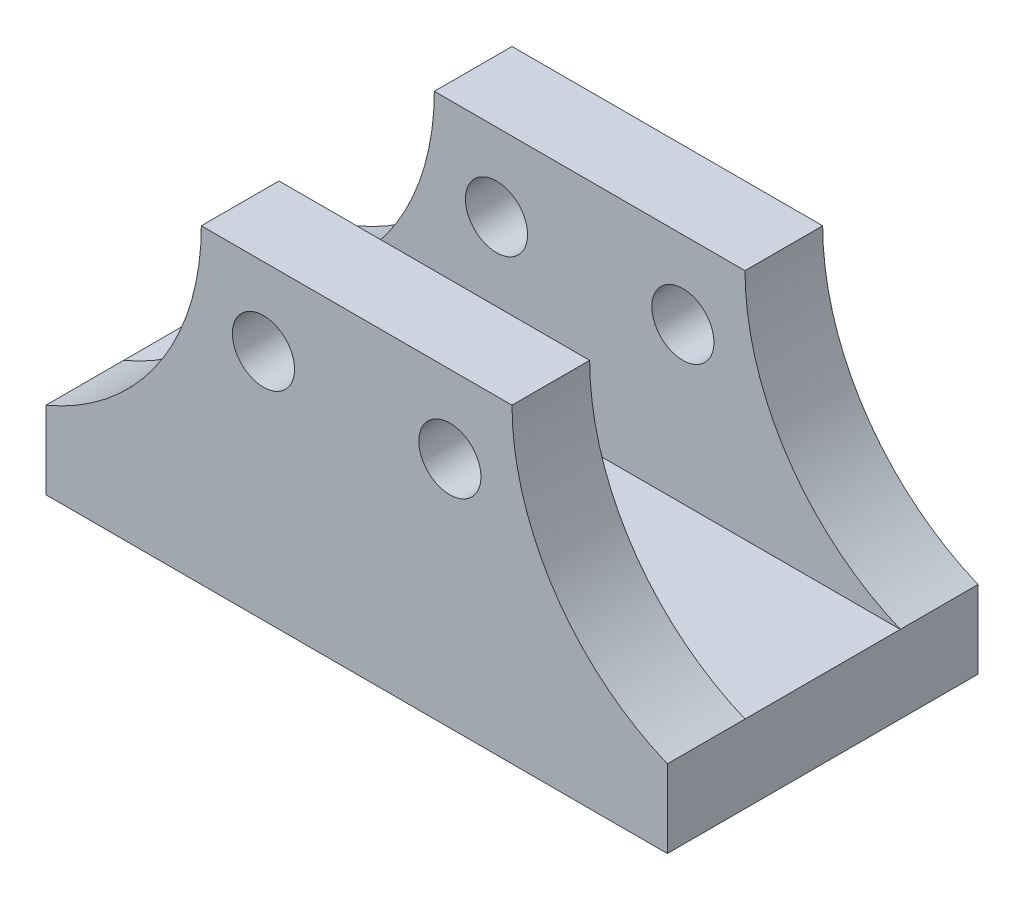
ISO-10303-21;
HEADER;
FILE_DESCRIPTION(('STEP AP214'),'2;1');
FILE_NAME('part.step','',(''),(''),'','','');
FILE_SCHEMA(('AUTOMOTIVE_DESIGN { 1 0 10303 214 1 1 1 1 }'));
ENDSEC;
DATA;
#1=APPLICATION_CONTEXT('core data for automotive mechanical design processes');
#2=APPLICATION_PROTOCOL_DEFINITION('international standard','automotive_design',2000,#1);
#3=PRODUCT_CONTEXT('',#1,'mechanical');
#4=PRODUCT('Part','Part','',(#3));
#5=PRODUCT_RELATED_PRODUCT_CATEGORY('part','',(#4));
#6=PRODUCT_DEFINITION_FORMATION('','',#4);
#7=PRODUCT_DEFINITION_CONTEXT('part definition',#1,'design');
#8=PRODUCT_DEFINITION('design','',#6,#7);
#9=PRODUCT_DEFINITION_SHAPE('','',#8);
#10=(LENGTH_UNIT() NAMED_UNIT(*) SI_UNIT(.MILLI.,.METRE.));
#11=(NAMED_UNIT(*) PLANE_ANGLE_UNIT() SI_UNIT($,.RADIAN.));
#12=(NAMED_UNIT(*) SI_UNIT($,.STERADIAN.) SOLID_ANGLE_UNIT());
#13=UNCERTAINTY_MEASURE_WITH_UNIT(LENGTH_MEASURE(1.E-05),#10,'distance_accuracy_value','');
#14=(GEOMETRIC_REPRESENTATION_CONTEXT(3) GLOBAL_UNCERTAINTY_ASSIGNED_CONTEXT((#13)) GLOBAL_UNIT_ASSIGNED_CONTEXT((#10,
#11,#12)) REPRESENTATION_CONTEXT('',''));
#15=CARTESIAN_POINT('',(0.,0.,0.));
#16=DIRECTION('',(0.,0.,1.));
#17=DIRECTION('',(1.,0.,0.));
#18=AXIS2_PLACEMENT_3D('',#15,#16,#17);
#19=CARTESIAN_POINT('',(-262.5,200.,-100.));
#20=DIRECTION('',(0.,0.,1.));
#21=DIRECTION('',(1.,0.,0.));
#22=AXIS2_PLACEMENT_3D('',#19,#20,#21);
#23=CYLINDRICAL_SURFACE('',#22,162.5);
#24=DIRECTION('',(0.,0.,1.));
#25=VECTOR('',#24,1.);
#26=CARTESIAN_POINT('',(-100.,200.,-100.));
#27=LINE('',#26,#25);
#28=CARTESIAN_POINT('',(-100.,200.,50.));
#29=VERTEX_POINT('',#28);
#30=CARTESIAN_POINT('',(-100.,200.,100.));
#31=VERTEX_POINT('',#30);
#32=EDGE_CURVE('E145',#29,#31,#27,.T.);
#33=ORIENTED_EDGE('',*,*,#32,.F.);
#34=CARTESIAN_POINT('',(-262.5,200.,50.));
#35=DIRECTION('',(0.,0.,-1.));
#36=DIRECTION('',(0.,1.,0.));
#37=AXIS2_PLACEMENT_3D('',#34,#35,#36);
#38=CIRCLE('',#37,162.5);
#39=CARTESIAN_POINT('',(-200.,50.,50.));
#40=VERTEX_POINT('',#39);
#41=EDGE_CURVE('E128',#29,#40,#38,.T.);
#42=ORIENTED_EDGE('',*,*,#41,.T.);
#43=DIRECTION('',(0.,0.,1.));
#44=VECTOR('',#43,1.);
#45=CARTESIAN_POINT('',(-200.,50.,-100.));
#46=LINE('',#45,#44);
#47=CARTESIAN_POINT('',(-200.,50.,100.));
#48=VERTEX_POINT('',#47);
#49=EDGE_CURVE('E91',#40,#48,#46,.T.);
#50=ORIENTED_EDGE('',*,*,#49,.T.);
#51=CARTESIAN_POINT('',(-262.5,200.,100.));
#52=DIRECTION('',(0.,0.,-1.));
#53=DIRECTION('',(1.,0.,0.));
#54=AXIS2_PLACEMENT_3D('',#51,#52,#53);
#55=CIRCLE('',#54,162.5);
#56=EDGE_CURVE('E215',#31,#48,#55,.T.);
#57=ORIENTED_EDGE('',*,*,#56,.F.);
#58=EDGE_LOOP('',(#33,#42,#50,#57));
#59=FACE_BOUND('',#58,.T.);
#60=ADVANCED_FACE('F36',(#59),#23,.F.);
#61=CARTESIAN_POINT('',(-200.,50.,-100.));
#62=VERTEX_POINT('',#61);
#63=CARTESIAN_POINT('',(-200.,50.,-50.));
#64=VERTEX_POINT('',#63);
#65=EDGE_CURVE('E153',#62,#64,#46,.T.);
#66=ORIENTED_EDGE('',*,*,#65,.T.);
#67=CARTESIAN_POINT('',(-262.5,200.,-50.));
#68=DIRECTION('',(0.,0.,1.));
#69=DIRECTION('',(0.,-1.,0.));
#70=AXIS2_PLACEMENT_3D('',#67,#68,#69);
#71=CIRCLE('',#70,162.5);
#72=CARTESIAN_POINT('',(-100.,200.,-50.));
#73=VERTEX_POINT('',#72);
#74=EDGE_CURVE('E206',#64,#73,#71,.T.);
#75=ORIENTED_EDGE('',*,*,#74,.T.);
#76=CARTESIAN_POINT('',(-100.,200.,-100.));
#77=VERTEX_POINT('',#76);
#78=EDGE_CURVE('E168',#77,#73,#27,.T.);
#79=ORIENTED_EDGE('',*,*,#78,.F.);
#80=CARTESIAN_POINT('',(-262.5,200.,-100.));
#81=DIRECTION('',(0.,0.,-1.));
#82=DIRECTION('',(1.,0.,0.));
#83=AXIS2_PLACEMENT_3D('',#80,#81,#82);
#84=CIRCLE('',#83,162.5);
#85=EDGE_CURVE('E222',#77,#62,#84,.T.);
#86=ORIENTED_EDGE('',*,*,#85,.T.);
#87=EDGE_LOOP('',(#66,#75,#79,#86));
#88=FACE_BOUND('',#87,.T.);
#89=ADVANCED_FACE('F240',(#88),#23,.F.);
#90=CARTESIAN_POINT('',(-100.,200.,-100.));
#91=DIRECTION('',(0.,1.,0.));
#92=DIRECTION('',(0.,0.,1.));
#93=AXIS2_PLACEMENT_3D('',#90,#91,#92);
#94=PLANE('',#93);
#95=DIRECTION('',(0.,0.,1.));
#96=VECTOR('',#95,1.);
#97=CARTESIAN_POINT('',(100.,200.,-100.));
#98=LINE('',#97,#96);
#99=CARTESIAN_POINT('',(100.,200.,50.));
#100=VERTEX_POINT('',#99);
#101=CARTESIAN_POINT('',(100.,200.,100.));
#102=VERTEX_POINT('',#101);
#103=EDGE_CURVE('E224',#100,#102,#98,.T.);
#104=ORIENTED_EDGE('',*,*,#103,.F.);
#105=DIRECTION('',(-1.,0.,0.));
#106=VECTOR('',#105,1.);
#107=CARTESIAN_POINT('',(-100.,200.,50.));
#108=LINE('',#107,#106);
#109=EDGE_CURVE('E147',#100,#29,#108,.T.);
#110=ORIENTED_EDGE('',*,*,#109,.T.);
#111=ORIENTED_EDGE('',*,*,#32,.T.);
#112=DIRECTION('',(-1.,0.,0.));
#113=VECTOR('',#112,1.);
#114=CARTESIAN_POINT('',(-100.,200.,100.));
#115=LINE('',#114,#113);
#116=EDGE_CURVE('E212',#102,#31,#115,.T.);
#117=ORIENTED_EDGE('',*,*,#116,.F.);
#118=EDGE_LOOP('',(#104,#110,#111,#117));
#119=FACE_BOUND('',#118,.T.);
#120=ADVANCED_FACE('F237',(#119),#94,.T.);
#121=ORIENTED_EDGE('',*,*,#78,.T.);
#122=DIRECTION('',(1.,0.,0.));
#123=VECTOR('',#122,1.);
#124=CARTESIAN_POINT('',(-100.,200.,-50.));
#125=LINE('',#124,#123);
#126=CARTESIAN_POINT('',(100.,200.,-50.));
#127=VERTEX_POINT('',#126);
#128=EDGE_CURVE('E131',#73,#127,#125,.T.);
#129=ORIENTED_EDGE('',*,*,#128,.T.);
#130=CARTESIAN_POINT('',(100.,200.,-100.));
#131=VERTEX_POINT('',#130);
#132=EDGE_CURVE('E159',#131,#127,#98,.T.);
#133=ORIENTED_EDGE('',*,*,#132,.F.);
#134=DIRECTION('',(-1.,0.,0.));
#135=VECTOR('',#134,1.);
#136=CARTESIAN_POINT('',(-100.,200.,-100.));
#137=LINE('',#136,#135);
#138=EDGE_CURVE('E219',#131,#77,#137,.T.);
#139=ORIENTED_EDGE('',*,*,#138,.T.);
#140=EDGE_LOOP('',(#121,#129,#133,#139));
#141=FACE_BOUND('',#140,.T.);
#142=ADVANCED_FACE('F239',(#141),#94,.T.);
#143=CARTESIAN_POINT('',(262.5,200.,-100.));
#144=DIRECTION('',(0.,0.,1.));
#145=DIRECTION('',(1.,0.,0.));
#146=AXIS2_PLACEMENT_3D('',#143,#144,#145);
#147=CYLINDRICAL_SURFACE('',#146,162.5);
#148=DIRECTION('',(0.,0.,-1.));
#149=VECTOR('',#148,1.);
#150=CARTESIAN_POINT('',(200.,50.,-100.));
#151=LINE('',#150,#149);
#152=CARTESIAN_POINT('',(200.,50.,100.));
#153=VERTEX_POINT('',#152);
#154=CARTESIAN_POINT('',(200.,50.,50.));
#155=VERTEX_POINT('',#154);
#156=EDGE_CURVE('E161',#153,#155,#151,.T.);
#157=ORIENTED_EDGE('',*,*,#156,.T.);
#158=CARTESIAN_POINT('',(262.5,200.,50.));
#159=DIRECTION('',(0.,0.,-1.));
#160=DIRECTION('',(0.,1.,0.));
#161=AXIS2_PLACEMENT_3D('',#158,#159,#160);
#162=CIRCLE('',#161,162.5);
#163=EDGE_CURVE('E11',#155,#100,#162,.T.);
#164=ORIENTED_EDGE('',*,*,#163,.T.);
#165=ORIENTED_EDGE('',*,*,#103,.T.);
#166=CARTESIAN_POINT('',(262.5,200.,100.));
#167=DIRECTION('',(0.,0.,-1.));
#168=DIRECTION('',(-1.,0.,0.));
#169=AXIS2_PLACEMENT_3D('',#166,#167,#168);
#170=CIRCLE('',#169,162.5);
#171=EDGE_CURVE('E146',#153,#102,#170,.T.);
#172=ORIENTED_EDGE('',*,*,#171,.F.);
#173=EDGE_LOOP('',(#157,#164,#165,#172));
#174=FACE_BOUND('',#173,.T.);
#175=ADVANCED_FACE('F233',(#174),#147,.F.);
#176=ORIENTED_EDGE('',*,*,#132,.T.);
#177=CARTESIAN_POINT('',(262.5,200.,-50.));
#178=DIRECTION('',(0.,0.,1.));
#179=DIRECTION('',(0.,-1.,0.));
#180=AXIS2_PLACEMENT_3D('',#177,#178,#179);
#181=CIRCLE('',#180,162.5);
#182=CARTESIAN_POINT('',(200.,50.,-50.));
#183=VERTEX_POINT('',#182);
#184=EDGE_CURVE('E45',#127,#183,#181,.T.);
#185=ORIENTED_EDGE('',*,*,#184,.T.);
#186=CARTESIAN_POINT('',(200.,50.,-100.));
#187=VERTEX_POINT('',#186);
#188=EDGE_CURVE('E62',#183,#187,#151,.T.);
#189=ORIENTED_EDGE('',*,*,#188,.T.);
#190=CARTESIAN_POINT('',(262.5,200.,-100.));
#191=DIRECTION('',(0.,0.,-1.));
#192=DIRECTION('',(-1.,0.,0.));
#193=AXIS2_PLACEMENT_3D('',#190,#191,#192);
#194=CIRCLE('',#193,162.5);
#195=EDGE_CURVE('E217',#187,#131,#194,.T.);
#196=ORIENTED_EDGE('',*,*,#195,.T.);
#197=EDGE_LOOP('',(#176,#185,#189,#196));
#198=FACE_BOUND('',#197,.T.);
#199=ADVANCED_FACE('F307',(#198),#147,.F.);
#200=CARTESIAN_POINT('',(-200.,50.,-100.));
#201=DIRECTION('',(1.,0.,0.));
#202=DIRECTION('',(0.,0.,-1.));
#203=AXIS2_PLACEMENT_3D('',#200,#201,#202);
#204=PLANE('',#203);
#205=DIRECTION('',(0.,0.,1.));
#206=VECTOR('',#205,1.);
#207=CARTESIAN_POINT('',(-200.,0.,-100.));
#208=LINE('',#207,#206);
#209=CARTESIAN_POINT('',(-200.,0.,-100.));
#210=VERTEX_POINT('',#209);
#211=CARTESIAN_POINT('',(-200.,0.,100.));
#212=VERTEX_POINT('',#211);
#213=EDGE_CURVE('E165',#210,#212,#208,.T.);
#214=ORIENTED_EDGE('',*,*,#213,.T.);
#215=DIRECTION('',(0.,-1.,0.));
#216=VECTOR('',#215,1.);
#217=CARTESIAN_POINT('',(-200.,50.,100.));
#218=LINE('',#217,#216);
#219=EDGE_CURVE('E151',#48,#212,#218,.T.);
#220=ORIENTED_EDGE('',*,*,#219,.F.);
#221=ORIENTED_EDGE('',*,*,#49,.F.);
#222=DIRECTION('',(0.,0.,-1.));
#223=VECTOR('',#222,1.);
#224=CARTESIAN_POINT('',(-200.,50.,50.));
#225=LINE('',#224,#223);
#226=EDGE_CURVE('E136',#40,#64,#225,.T.);
#227=ORIENTED_EDGE('',*,*,#226,.T.);
#228=ORIENTED_EDGE('',*,*,#65,.F.);
#229=DIRECTION('',(0.,-1.,0.));
#230=VECTOR('',#229,1.);
#231=CARTESIAN_POINT('',(-200.,50.,-100.));
#232=LINE('',#231,#230);
#233=EDGE_CURVE('E164',#62,#210,#232,.T.);
#234=ORIENTED_EDGE('',*,*,#233,.T.);
#235=EDGE_LOOP('',(#214,#220,#221,#227,#228,#234));
#236=FACE_BOUND('',#235,.T.);
#237=ADVANCED_FACE('F38',(#236),#204,.F.);
#238=CARTESIAN_POINT('',(-200.,50.,100.));
#239=DIRECTION('',(0.,0.,-1.));
#240=DIRECTION('',(-1.,0.,0.));
#241=AXIS2_PLACEMENT_3D('',#238,#239,#240);
#242=PLANE('',#241);
#243=CARTESIAN_POINT('',(-60.,150.,100.));
#244=DIRECTION('',(0.,0.,-1.));
#245=DIRECTION('',(-1.,0.,0.));
#246=AXIS2_PLACEMENT_3D('',#243,#244,#245);
#247=CIRCLE('',#246,20.);
#248=CARTESIAN_POINT('',(-80.,150.,100.));
#249=VERTEX_POINT('',#248);
#250=EDGE_CURVE('E142',#249,#249,#247,.F.);
#251=ORIENTED_EDGE('',*,*,#250,.F.);
#252=EDGE_LOOP('',(#251));
#253=FACE_BOUND('',#252,.T.);
#254=CARTESIAN_POINT('',(60.,150.,100.));
#255=DIRECTION('',(0.,0.,-1.));
#256=DIRECTION('',(-1.,0.,0.));
#257=AXIS2_PLACEMENT_3D('',#254,#255,#256);
#258=CIRCLE('',#257,20.);
#259=CARTESIAN_POINT('',(40.,150.,100.));
#260=VERTEX_POINT('',#259);
#261=EDGE_CURVE('E189',#260,#260,#258,.F.);
#262=ORIENTED_EDGE('',*,*,#261,.F.);
#263=EDGE_LOOP('',(#262));
#264=FACE_BOUND('',#263,.T.);
#265=DIRECTION('',(1.,0.,0.));
#266=VECTOR('',#265,1.);
#267=CARTESIAN_POINT('',(-200.,0.,100.));
#268=LINE('',#267,#266);
#269=CARTESIAN_POINT('',(200.,0.,100.));
#270=VERTEX_POINT('',#269);
#271=EDGE_CURVE('E167',#212,#270,#268,.T.);
#272=ORIENTED_EDGE('',*,*,#271,.T.);
#273=DIRECTION('',(0.,-1.,0.));
#274=VECTOR('',#273,1.);
#275=CARTESIAN_POINT('',(200.,50.,100.));
#276=LINE('',#275,#274);
#277=EDGE_CURVE('E174',#153,#270,#276,.T.);
#278=ORIENTED_EDGE('',*,*,#277,.F.);
#279=ORIENTED_EDGE('',*,*,#171,.T.);
#280=ORIENTED_EDGE('',*,*,#116,.T.);
#281=ORIENTED_EDGE('',*,*,#56,.T.);
#282=ORIENTED_EDGE('',*,*,#219,.T.);
#283=EDGE_LOOP('',(#272,#278,#279,#280,#281,#282));
#284=FACE_BOUND('',#283,.T.);
#285=ADVANCED_FACE('F235',(#253,#264,#284),#242,.F.);
#286=CARTESIAN_POINT('',(200.,50.,-100.));
#287=DIRECTION('',(-1.,0.,0.));
#288=DIRECTION('',(0.,0.,1.));
#289=AXIS2_PLACEMENT_3D('',#286,#287,#288);
#290=PLANE('',#289);
#291=DIRECTION('',(0.,0.,-1.));
#292=VECTOR('',#291,1.);
#293=CARTESIAN_POINT('',(200.,0.,-100.));
#294=LINE('',#293,#292);
#295=CARTESIAN_POINT('',(200.,0.,-100.));
#296=VERTEX_POINT('',#295);
#297=EDGE_CURVE('E155',#270,#296,#294,.T.);
#298=ORIENTED_EDGE('',*,*,#297,.T.);
#299=DIRECTION('',(0.,-1.,0.));
#300=VECTOR('',#299,1.);
#301=CARTESIAN_POINT('',(200.,50.,-100.));
#302=LINE('',#301,#300);
#303=EDGE_CURVE('E172',#187,#296,#302,.T.);
#304=ORIENTED_EDGE('',*,*,#303,.F.);
#305=ORIENTED_EDGE('',*,*,#188,.F.);
#306=DIRECTION('',(0.,0.,-1.));
#307=VECTOR('',#306,1.);
#308=CARTESIAN_POINT('',(200.,50.,50.));
#309=LINE('',#308,#307);
#310=EDGE_CURVE('E141',#155,#183,#309,.T.);
#311=ORIENTED_EDGE('',*,*,#310,.F.);
#312=ORIENTED_EDGE('',*,*,#156,.F.);
#313=ORIENTED_EDGE('',*,*,#277,.T.);
#314=EDGE_LOOP('',(#298,#304,#305,#311,#312,#313));
#315=FACE_BOUND('',#314,.T.);
#316=ADVANCED_FACE('F290',(#315),#290,.F.);
#317=CARTESIAN_POINT('',(-200.,50.,-100.));
#318=DIRECTION('',(0.,0.,1.));
#319=DIRECTION('',(1.,0.,0.));
#320=AXIS2_PLACEMENT_3D('',#317,#318,#319);
#321=PLANE('',#320);
#322=CARTESIAN_POINT('',(-60.,150.,-100.));
#323=DIRECTION('',(0.,0.,1.));
#324=DIRECTION('',(1.,0.,0.));
#325=AXIS2_PLACEMENT_3D('',#322,#323,#324);
#326=CIRCLE('',#325,20.);
#327=CARTESIAN_POINT('',(-40.,150.,-100.));
#328=VERTEX_POINT('',#327);
#329=EDGE_CURVE('E197',#328,#328,#326,.F.);
#330=ORIENTED_EDGE('',*,*,#329,.F.);
#331=EDGE_LOOP('',(#330));
#332=FACE_BOUND('',#331,.T.);
#333=CARTESIAN_POINT('',(60.,150.,-100.));
#334=DIRECTION('',(0.,0.,1.));
#335=DIRECTION('',(1.,0.,0.));
#336=AXIS2_PLACEMENT_3D('',#333,#334,#335);
#337=CIRCLE('',#336,20.);
#338=CARTESIAN_POINT('',(80.,150.,-100.));
#339=VERTEX_POINT('',#338);
#340=EDGE_CURVE('E184',#339,#339,#337,.F.);
#341=ORIENTED_EDGE('',*,*,#340,.F.);
#342=EDGE_LOOP('',(#341));
#343=FACE_BOUND('',#342,.T.);
#344=DIRECTION('',(-1.,0.,0.));
#345=VECTOR('',#344,1.);
#346=CARTESIAN_POINT('',(-200.,0.,-100.));
#347=LINE('',#346,#345);
#348=EDGE_CURVE('E84',#296,#210,#347,.T.);
#349=ORIENTED_EDGE('',*,*,#348,.T.);
#350=ORIENTED_EDGE('',*,*,#233,.F.);
#351=ORIENTED_EDGE('',*,*,#85,.F.);
#352=ORIENTED_EDGE('',*,*,#138,.F.);
#353=ORIENTED_EDGE('',*,*,#195,.F.);
#354=ORIENTED_EDGE('',*,*,#303,.T.);
#355=EDGE_LOOP('',(#349,#350,#351,#352,#353,#354));
#356=FACE_BOUND('',#355,.T.);
#357=ADVANCED_FACE('F287',(#332,#343,#356),#321,.F.);
#358=CARTESIAN_POINT('',(0.,0.,0.));
#359=DIRECTION('',(0.,1.,0.));
#360=DIRECTION('',(0.,0.,1.));
#361=AXIS2_PLACEMENT_3D('',#358,#359,#360);
#362=PLANE('',#361);
#363=ORIENTED_EDGE('',*,*,#213,.F.);
#364=ORIENTED_EDGE('',*,*,#348,.F.);
#365=ORIENTED_EDGE('',*,*,#297,.F.);
#366=ORIENTED_EDGE('',*,*,#271,.F.);
#367=EDGE_LOOP('',(#363,#364,#365,#366));
#368=FACE_BOUND('',#367,.T.);
#369=ADVANCED_FACE('F255',(#368),#362,.F.);
#370=CARTESIAN_POINT('',(200.,235.844044805955,50.));
#371=DIRECTION('',(0.,0.,-1.));
#372=DIRECTION('',(0.,1.,0.));
#373=AXIS2_PLACEMENT_3D('',#370,#371,#372);
#374=PLANE('',#373);
#375=CARTESIAN_POINT('',(-60.,150.,50.));
#376=DIRECTION('',(0.,0.,-1.));
#377=DIRECTION('',(0.,1.,0.));
#378=AXIS2_PLACEMENT_3D('',#375,#376,#377);
#379=CIRCLE('',#378,20.);
#380=CARTESIAN_POINT('',(-60.,170.,50.));
#381=VERTEX_POINT('',#380);
#382=EDGE_CURVE('E194',#381,#381,#379,.F.);
#383=ORIENTED_EDGE('',*,*,#382,.T.);
#384=EDGE_LOOP('',(#383));
#385=FACE_BOUND('',#384,.T.);
#386=CARTESIAN_POINT('',(60.,150.,50.));
#387=DIRECTION('',(0.,0.,-1.));
#388=DIRECTION('',(0.,1.,0.));
#389=AXIS2_PLACEMENT_3D('',#386,#387,#388);
#390=CIRCLE('',#389,20.);
#391=CARTESIAN_POINT('',(60.,170.,50.));
#392=VERTEX_POINT('',#391);
#393=EDGE_CURVE('E180',#392,#392,#390,.F.);
#394=ORIENTED_EDGE('',*,*,#393,.T.);
#395=EDGE_LOOP('',(#394));
#396=FACE_BOUND('',#395,.T.);
#397=ORIENTED_EDGE('',*,*,#109,.F.);
#398=ORIENTED_EDGE('',*,*,#163,.F.);
#399=DIRECTION('',(-1.,0.,0.));
#400=VECTOR('',#399,1.);
#401=CARTESIAN_POINT('',(200.,50.,50.));
#402=LINE('',#401,#400);
#403=EDGE_CURVE('E53',#155,#40,#402,.T.);
#404=ORIENTED_EDGE('',*,*,#403,.T.);
#405=ORIENTED_EDGE('',*,*,#41,.F.);
#406=EDGE_LOOP('',(#397,#398,#404,#405));
#407=FACE_BOUND('',#406,.T.);
#408=ADVANCED_FACE('F127',(#385,#396,#407),#374,.T.);
#409=CARTESIAN_POINT('',(200.,50.,50.));
#410=DIRECTION('',(0.,1.,0.));
#411=DIRECTION('',(0.,0.,1.));
#412=AXIS2_PLACEMENT_3D('',#409,#410,#411);
#413=PLANE('',#412);
#414=ORIENTED_EDGE('',*,*,#403,.F.);
#415=ORIENTED_EDGE('',*,*,#310,.T.);
#416=DIRECTION('',(-1.,0.,0.));
#417=VECTOR('',#416,1.);
#418=CARTESIAN_POINT('',(200.,50.,-50.));
#419=LINE('',#418,#417);
#420=EDGE_CURVE('E132',#183,#64,#419,.T.);
#421=ORIENTED_EDGE('',*,*,#420,.T.);
#422=ORIENTED_EDGE('',*,*,#226,.F.);
#423=EDGE_LOOP('',(#414,#415,#421,#422));
#424=FACE_BOUND('',#423,.T.);
#425=ADVANCED_FACE('F137',(#424),#413,.T.);
#426=CARTESIAN_POINT('',(200.,235.844044805955,-50.));
#427=DIRECTION('',(0.,0.,1.));
#428=DIRECTION('',(0.,-1.,0.));
#429=AXIS2_PLACEMENT_3D('',#426,#427,#428);
#430=PLANE('',#429);
#431=CARTESIAN_POINT('',(-60.,150.,-50.));
#432=DIRECTION('',(0.,0.,1.));
#433=DIRECTION('',(0.,-1.,0.));
#434=AXIS2_PLACEMENT_3D('',#431,#432,#433);
#435=CIRCLE('',#434,20.);
#436=CARTESIAN_POINT('',(-60.,130.,-50.));
#437=VERTEX_POINT('',#436);
#438=EDGE_CURVE('E40',#437,#437,#435,.F.);
#439=ORIENTED_EDGE('',*,*,#438,.T.);
#440=EDGE_LOOP('',(#439));
#441=FACE_BOUND('',#440,.T.);
#442=CARTESIAN_POINT('',(60.,150.,-50.));
#443=DIRECTION('',(0.,0.,1.));
#444=DIRECTION('',(0.,-1.,0.));
#445=AXIS2_PLACEMENT_3D('',#442,#443,#444);
#446=CIRCLE('',#445,20.);
#447=CARTESIAN_POINT('',(60.,130.,-50.));
#448=VERTEX_POINT('',#447);
#449=EDGE_CURVE('E178',#448,#448,#446,.F.);
#450=ORIENTED_EDGE('',*,*,#449,.T.);
#451=EDGE_LOOP('',(#450));
#452=FACE_BOUND('',#451,.T.);
#453=ORIENTED_EDGE('',*,*,#420,.F.);
#454=ORIENTED_EDGE('',*,*,#184,.F.);
#455=ORIENTED_EDGE('',*,*,#128,.F.);
#456=ORIENTED_EDGE('',*,*,#74,.F.);
#457=EDGE_LOOP('',(#453,#454,#455,#456));
#458=FACE_BOUND('',#457,.T.);
#459=ADVANCED_FACE('F259',(#441,#452,#458),#430,.T.);
#460=CARTESIAN_POINT('',(60.,150.,200.));
#461=DIRECTION('',(0.,0.,-1.));
#462=DIRECTION('',(-1.,0.,0.));
#463=AXIS2_PLACEMENT_3D('',#460,#461,#462);
#464=CYLINDRICAL_SURFACE('',#463,20.);
#465=ORIENTED_EDGE('',*,*,#449,.F.);
#466=EDGE_LOOP('',(#465));
#467=FACE_BOUND('',#466,.T.);
#468=ORIENTED_EDGE('',*,*,#340,.T.);
#469=EDGE_LOOP('',(#468));
#470=FACE_BOUND('',#469,.T.);
#471=ADVANCED_FACE('F262',(#467,#470),#464,.F.);
#472=CARTESIAN_POINT('',(-60.,150.,200.));
#473=DIRECTION('',(0.,0.,-1.));
#474=DIRECTION('',(-1.,0.,0.));
#475=AXIS2_PLACEMENT_3D('',#472,#473,#474);
#476=CYLINDRICAL_SURFACE('',#475,20.);
#477=ORIENTED_EDGE('',*,*,#438,.F.);
#478=EDGE_LOOP('',(#477));
#479=FACE_BOUND('',#478,.T.);
#480=ORIENTED_EDGE('',*,*,#329,.T.);
#481=EDGE_LOOP('',(#480));
#482=FACE_BOUND('',#481,.T.);
#483=ADVANCED_FACE('F268',(#479,#482),#476,.F.);
#484=ORIENTED_EDGE('',*,*,#393,.F.);
#485=EDGE_LOOP('',(#484));
#486=FACE_BOUND('',#485,.T.);
#487=ORIENTED_EDGE('',*,*,#261,.T.);
#488=EDGE_LOOP('',(#487));
#489=FACE_BOUND('',#488,.T.);
#490=ADVANCED_FACE('F264',(#486,#489),#464,.F.);
#491=ORIENTED_EDGE('',*,*,#382,.F.);
#492=EDGE_LOOP('',(#491));
#493=FACE_BOUND('',#492,.T.);
#494=ORIENTED_EDGE('',*,*,#250,.T.);
#495=EDGE_LOOP('',(#494));
#496=FACE_BOUND('',#495,.T.);
#497=ADVANCED_FACE('F267',(#493,#496),#476,.F.);
#498=CLOSED_SHELL('',(#60,#89,#120,#142,#175,#199,#237,#285,#316,#357,#369,#408,#425,#459,#471,
#483,#490,#497));
#499=MANIFOLD_SOLID_BREP('B2',#498);
#500=ADVANCED_BREP_SHAPE_REPRESENTATION('',(#18,#499),#14);
#501=SHAPE_DEFINITION_REPRESENTATION(#9,#500);
ENDSEC;
END-ISO-10303-21;
